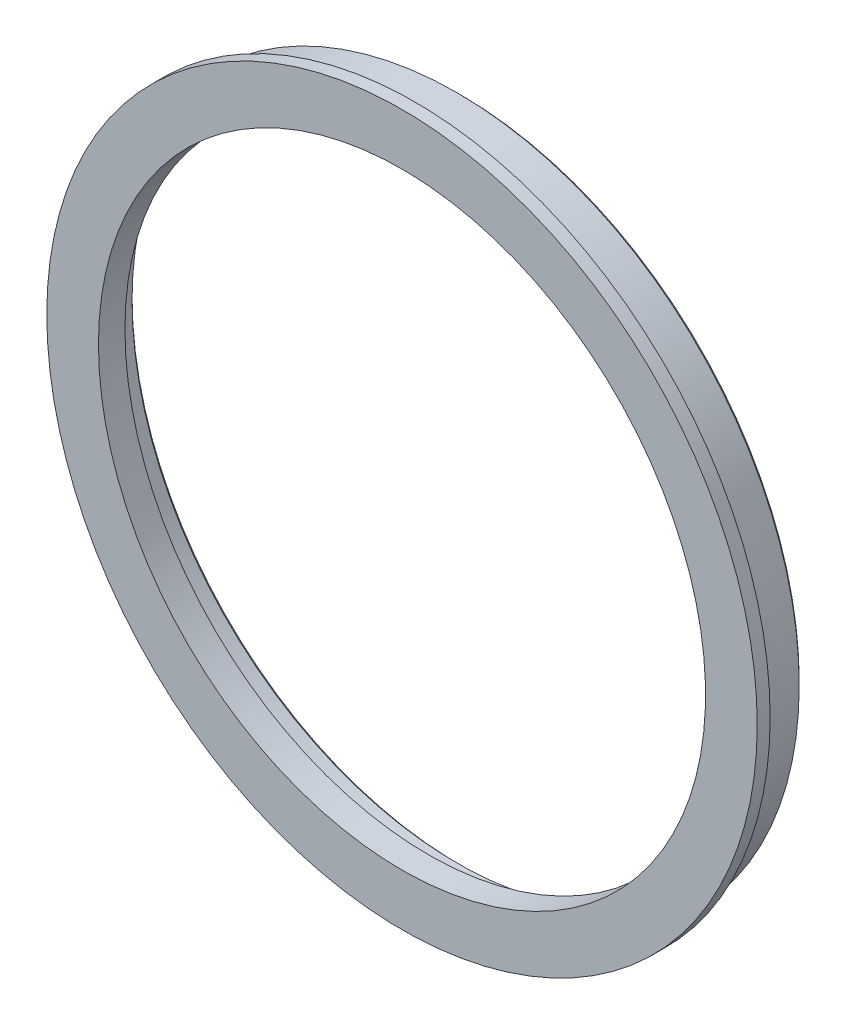
ISO-10303-21;
HEADER;
FILE_DESCRIPTION(('STEP AP214'),'2;1');
FILE_NAME('part.step','',(''),(''),'','','');
FILE_SCHEMA(('AUTOMOTIVE_DESIGN { 1 0 10303 214 1 1 1 1 }'));
ENDSEC;
DATA;
#1=APPLICATION_CONTEXT('core data for automotive mechanical design processes');
#2=APPLICATION_PROTOCOL_DEFINITION('international standard','automotive_design',2000,#1);
#3=PRODUCT_CONTEXT('',#1,'mechanical');
#4=PRODUCT('Part','Part','',(#3));
#5=PRODUCT_RELATED_PRODUCT_CATEGORY('part','',(#4));
#6=PRODUCT_DEFINITION_FORMATION('','',#4);
#7=PRODUCT_DEFINITION_CONTEXT('part definition',#1,'design');
#8=PRODUCT_DEFINITION('design','',#6,#7);
#9=PRODUCT_DEFINITION_SHAPE('','',#8);
#10=(LENGTH_UNIT() NAMED_UNIT(*) SI_UNIT(.MILLI.,.METRE.));
#11=(NAMED_UNIT(*) PLANE_ANGLE_UNIT() SI_UNIT($,.RADIAN.));
#12=(NAMED_UNIT(*) SI_UNIT($,.STERADIAN.) SOLID_ANGLE_UNIT());
#13=UNCERTAINTY_MEASURE_WITH_UNIT(LENGTH_MEASURE(1.E-05),#10,'distance_accuracy_value','');
#14=(GEOMETRIC_REPRESENTATION_CONTEXT(3) GLOBAL_UNCERTAINTY_ASSIGNED_CONTEXT((#13)) GLOBAL_UNIT_ASSIGNED_CONTEXT((#10,
#11,#12)) REPRESENTATION_CONTEXT('',''));
#15=CARTESIAN_POINT('',(0.,0.,0.));
#16=DIRECTION('',(0.,0.,1.));
#17=DIRECTION('',(1.,0.,0.));
#18=AXIS2_PLACEMENT_3D('',#15,#16,#17);
#19=CARTESIAN_POINT('',(53.,0.,-19.));
#20=DIRECTION('',(0.,0.,1.));
#21=DIRECTION('',(1.,0.,0.));
#22=AXIS2_PLACEMENT_3D('',#19,#20,#21);
#23=PLANE('',#22);
#24=CARTESIAN_POINT('',(0.,0.,-19.));
#25=DIRECTION('',(0.,0.,1.));
#26=DIRECTION('',(1.,0.,0.));
#27=AXIS2_PLACEMENT_3D('',#24,#25,#26);
#28=CIRCLE('',#27,52.5);
#29=CARTESIAN_POINT('',(52.5,0.,-19.));
#30=VERTEX_POINT('',#29);
#31=EDGE_CURVE('E50',#30,#30,#28,.F.);
#32=ORIENTED_EDGE('',*,*,#31,.T.);
#33=EDGE_LOOP('',(#32));
#34=FACE_BOUND('',#33,.T.);
#35=CARTESIAN_POINT('',(0.,0.,-19.));
#36=DIRECTION('',(0.,0.,1.));
#37=DIRECTION('',(1.,0.,0.));
#38=AXIS2_PLACEMENT_3D('',#35,#36,#37);
#39=CIRCLE('',#38,50.8);
#40=CARTESIAN_POINT('',(50.8,0.,-19.));
#41=VERTEX_POINT('',#40);
#42=EDGE_CURVE('E55',#41,#41,#39,.T.);
#43=ORIENTED_EDGE('',*,*,#42,.T.);
#44=EDGE_LOOP('',(#43));
#45=FACE_BOUND('',#44,.T.);
#46=ADVANCED_FACE('F37',(#34,#45),#23,.F.);
#47=CARTESIAN_POINT('',(0.,0.,-69.1698473282442));
#48=DIRECTION('',(0.,0.,-1.));
#49=DIRECTION('',(-1.,0.,0.));
#50=AXIS2_PLACEMENT_3D('',#47,#48,#49);
#51=CYLINDRICAL_SURFACE('',#50,50.3);
#52=CARTESIAN_POINT('',(0.,0.,-18.5));
#53=DIRECTION('',(0.,0.,1.));
#54=DIRECTION('',(1.,0.,0.));
#55=AXIS2_PLACEMENT_3D('',#52,#53,#54);
#56=CIRCLE('',#55,50.3);
#57=CARTESIAN_POINT('',(50.3,0.,-18.5));
#58=VERTEX_POINT('',#57);
#59=EDGE_CURVE('E10',#58,#58,#56,.F.);
#60=ORIENTED_EDGE('',*,*,#59,.T.);
#61=EDGE_LOOP('',(#60));
#62=FACE_BOUND('',#61,.T.);
#63=CARTESIAN_POINT('',(0.,0.,-14.1));
#64=DIRECTION('',(0.,0.,-1.));
#65=DIRECTION('',(-1.,0.,0.));
#66=AXIS2_PLACEMENT_3D('',#63,#64,#65);
#67=CIRCLE('',#66,50.3);
#68=CARTESIAN_POINT('',(-50.3,0.,-14.1));
#69=VERTEX_POINT('',#68);
#70=EDGE_CURVE('E61',#69,#69,#67,.T.);
#71=ORIENTED_EDGE('',*,*,#70,.F.);
#72=EDGE_LOOP('',(#71));
#73=FACE_BOUND('',#72,.T.);
#74=ADVANCED_FACE('F105',(#62,#73),#51,.F.);
#75=CARTESIAN_POINT('',(50.3,0.,-14.1));
#76=DIRECTION('',(0.,0.,1.));
#77=DIRECTION('',(1.,0.,0.));
#78=AXIS2_PLACEMENT_3D('',#75,#76,#77);
#79=PLANE('',#78);
#80=CARTESIAN_POINT('',(0.,0.,-14.1));
#81=DIRECTION('',(0.,0.,-1.));
#82=DIRECTION('',(-1.,0.,0.));
#83=AXIS2_PLACEMENT_3D('',#80,#81,#82);
#84=CIRCLE('',#83,47.);
#85=CARTESIAN_POINT('',(-47.,0.,-14.1));
#86=VERTEX_POINT('',#85);
#87=EDGE_CURVE('E65',#86,#86,#84,.T.);
#88=ORIENTED_EDGE('',*,*,#87,.F.);
#89=EDGE_LOOP('',(#88));
#90=FACE_BOUND('',#89,.T.);
#91=ORIENTED_EDGE('',*,*,#70,.T.);
#92=EDGE_LOOP('',(#91));
#93=FACE_BOUND('',#92,.T.);
#94=ADVANCED_FACE('F101',(#90,#93),#79,.F.);
#95=CARTESIAN_POINT('',(0.,0.,-69.1698473282442));
#96=DIRECTION('',(0.,0.,-1.));
#97=DIRECTION('',(-1.,0.,0.));
#98=AXIS2_PLACEMENT_3D('',#95,#96,#97);
#99=CYLINDRICAL_SURFACE('',#98,47.);
#100=CARTESIAN_POINT('',(0.,0.,-10.));
#101=DIRECTION('',(0.,0.,-1.));
#102=DIRECTION('',(-1.,0.,0.));
#103=AXIS2_PLACEMENT_3D('',#100,#101,#102);
#104=CIRCLE('',#103,47.);
#105=CARTESIAN_POINT('',(-47.,0.,-10.));
#106=VERTEX_POINT('',#105);
#107=EDGE_CURVE('E81',#106,#106,#104,.F.);
#108=ORIENTED_EDGE('',*,*,#107,.T.);
#109=EDGE_LOOP('',(#108));
#110=FACE_BOUND('',#109,.T.);
#111=ORIENTED_EDGE('',*,*,#87,.T.);
#112=EDGE_LOOP('',(#111));
#113=FACE_BOUND('',#112,.T.);
#114=ADVANCED_FACE('F86',(#110,#113),#99,.F.);
#115=CARTESIAN_POINT('',(49.,0.,-10.));
#116=DIRECTION('',(0.,0.,-1.));
#117=DIRECTION('',(-1.,0.,0.));
#118=AXIS2_PLACEMENT_3D('',#115,#116,#117);
#119=PLANE('',#118);
#120=CARTESIAN_POINT('',(0.,0.,-10.));
#121=DIRECTION('',(0.,0.,-1.));
#122=DIRECTION('',(-1.,0.,0.));
#123=AXIS2_PLACEMENT_3D('',#120,#121,#122);
#124=CIRCLE('',#123,55.);
#125=CARTESIAN_POINT('',(-55.,0.,-10.));
#126=VERTEX_POINT('',#125);
#127=EDGE_CURVE('E69',#126,#126,#124,.T.);
#128=ORIENTED_EDGE('',*,*,#127,.F.);
#129=EDGE_LOOP('',(#128));
#130=FACE_BOUND('',#129,.T.);
#131=ORIENTED_EDGE('',*,*,#107,.F.);
#132=EDGE_LOOP('',(#131));
#133=FACE_BOUND('',#132,.T.);
#134=ADVANCED_FACE('F89',(#130,#133),#119,.F.);
#135=CARTESIAN_POINT('',(0.,0.,-69.1698473282442));
#136=DIRECTION('',(0.,0.,-1.));
#137=DIRECTION('',(-1.,0.,0.));
#138=AXIS2_PLACEMENT_3D('',#135,#136,#137);
#139=CYLINDRICAL_SURFACE('',#138,55.);
#140=CARTESIAN_POINT('',(0.,0.,-12.));
#141=DIRECTION('',(0.,0.,-1.));
#142=DIRECTION('',(-1.,0.,0.));
#143=AXIS2_PLACEMENT_3D('',#140,#141,#142);
#144=CIRCLE('',#143,55.);
#145=CARTESIAN_POINT('',(-55.,0.,-12.));
#146=VERTEX_POINT('',#145);
#147=EDGE_CURVE('E73',#146,#146,#144,.T.);
#148=ORIENTED_EDGE('',*,*,#147,.F.);
#149=EDGE_LOOP('',(#148));
#150=FACE_BOUND('',#149,.T.);
#151=ORIENTED_EDGE('',*,*,#127,.T.);
#152=EDGE_LOOP('',(#151));
#153=FACE_BOUND('',#152,.T.);
#154=ADVANCED_FACE('F91',(#150,#153),#139,.T.);
#155=CARTESIAN_POINT('',(55.,0.,-12.));
#156=DIRECTION('',(0.,0.,1.));
#157=DIRECTION('',(1.,0.,0.));
#158=AXIS2_PLACEMENT_3D('',#155,#156,#157);
#159=PLANE('',#158);
#160=CARTESIAN_POINT('',(0.,0.,-12.));
#161=DIRECTION('',(0.,0.,-1.));
#162=DIRECTION('',(-1.,0.,0.));
#163=AXIS2_PLACEMENT_3D('',#160,#161,#162);
#164=CIRCLE('',#163,53.);
#165=CARTESIAN_POINT('',(-53.,0.,-12.));
#166=VERTEX_POINT('',#165);
#167=EDGE_CURVE('E77',#166,#166,#164,.T.);
#168=ORIENTED_EDGE('',*,*,#167,.F.);
#169=EDGE_LOOP('',(#168));
#170=FACE_BOUND('',#169,.T.);
#171=ORIENTED_EDGE('',*,*,#147,.T.);
#172=EDGE_LOOP('',(#171));
#173=FACE_BOUND('',#172,.T.);
#174=ADVANCED_FACE('F98',(#170,#173),#159,.F.);
#175=CARTESIAN_POINT('',(0.,0.,-69.1698473282442));
#176=DIRECTION('',(0.,0.,-1.));
#177=DIRECTION('',(-1.,0.,0.));
#178=AXIS2_PLACEMENT_3D('',#175,#176,#177);
#179=CYLINDRICAL_SURFACE('',#178,53.);
#180=CARTESIAN_POINT('',(0.,0.,-18.5));
#181=DIRECTION('',(0.,0.,1.));
#182=DIRECTION('',(1.,0.,0.));
#183=AXIS2_PLACEMENT_3D('',#180,#181,#182);
#184=CIRCLE('',#183,53.);
#185=CARTESIAN_POINT('',(53.,0.,-18.5));
#186=VERTEX_POINT('',#185);
#187=EDGE_CURVE('E45',#186,#186,#184,.T.);
#188=ORIENTED_EDGE('',*,*,#187,.T.);
#189=EDGE_LOOP('',(#188));
#190=FACE_BOUND('',#189,.T.);
#191=ORIENTED_EDGE('',*,*,#167,.T.);
#192=EDGE_LOOP('',(#191));
#193=FACE_BOUND('',#192,.T.);
#194=ADVANCED_FACE('F116',(#190,#193),#179,.T.);
#195=CARTESIAN_POINT('',(0.,0.,-19.));
#196=DIRECTION('',(0.,0.,1.));
#197=DIRECTION('',(1.,0.,0.));
#198=AXIS2_PLACEMENT_3D('',#195,#196,#197);
#199=CONICAL_SURFACE('',#198,52.5,0.785398163397462);
#200=ORIENTED_EDGE('',*,*,#187,.F.);
#201=EDGE_LOOP('',(#200));
#202=FACE_BOUND('',#201,.T.);
#203=ORIENTED_EDGE('',*,*,#31,.F.);
#204=EDGE_LOOP('',(#203));
#205=FACE_BOUND('',#204,.T.);
#206=ADVANCED_FACE('F114',(#202,#205),#199,.T.);
#207=CARTESIAN_POINT('',(0.,0.,-18.5));
#208=DIRECTION('',(0.,0.,-1.));
#209=DIRECTION('',(-1.,0.,0.));
#210=AXIS2_PLACEMENT_3D('',#207,#208,#209);
#211=CONICAL_SURFACE('',#210,50.3,0.785398163397441);
#212=ORIENTED_EDGE('',*,*,#42,.F.);
#213=EDGE_LOOP('',(#212));
#214=FACE_BOUND('',#213,.T.);
#215=ORIENTED_EDGE('',*,*,#59,.F.);
#216=EDGE_LOOP('',(#215));
#217=FACE_BOUND('',#216,.T.);
#218=ADVANCED_FACE('F39',(#214,#217),#211,.F.);
#219=CLOSED_SHELL('',(#46,#74,#94,#114,#134,#154,#174,#194,#206,#218));
#220=MANIFOLD_SOLID_BREP('B2',#219);
#221=ADVANCED_BREP_SHAPE_REPRESENTATION('',(#18,#220),#14);
#222=SHAPE_DEFINITION_REPRESENTATION(#9,#221);
ENDSEC;
END-ISO-10303-21;
